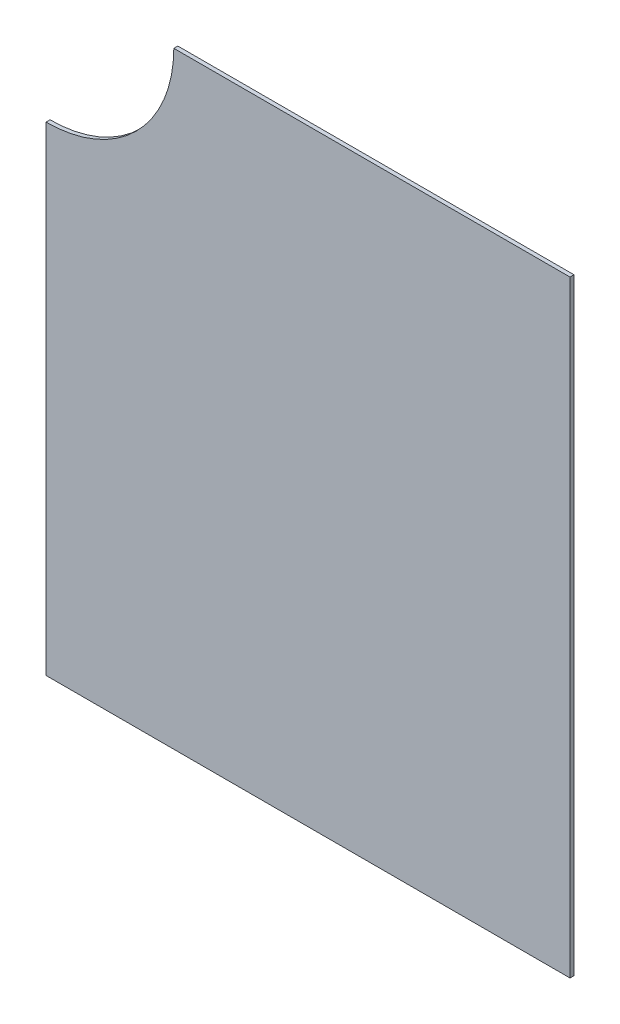
ISO-10303-21;
HEADER;
FILE_DESCRIPTION(('STEP AP214'),'2;1');
FILE_NAME('part.step','',(''),(''),'','','');
FILE_SCHEMA(('AUTOMOTIVE_DESIGN { 1 0 10303 214 1 1 1 1 }'));
ENDSEC;
DATA;
#1=APPLICATION_CONTEXT('core data for automotive mechanical design processes');
#2=APPLICATION_PROTOCOL_DEFINITION('international standard','automotive_design',2000,#1);
#3=PRODUCT_CONTEXT('',#1,'mechanical');
#4=PRODUCT('Part','Part','',(#3));
#5=PRODUCT_RELATED_PRODUCT_CATEGORY('part','',(#4));
#6=PRODUCT_DEFINITION_FORMATION('','',#4);
#7=PRODUCT_DEFINITION_CONTEXT('part definition',#1,'design');
#8=PRODUCT_DEFINITION('design','',#6,#7);
#9=PRODUCT_DEFINITION_SHAPE('','',#8);
#10=(LENGTH_UNIT() NAMED_UNIT(*) SI_UNIT(.MILLI.,.METRE.));
#11=(NAMED_UNIT(*) PLANE_ANGLE_UNIT() SI_UNIT($,.RADIAN.));
#12=(NAMED_UNIT(*) SI_UNIT($,.STERADIAN.) SOLID_ANGLE_UNIT());
#13=UNCERTAINTY_MEASURE_WITH_UNIT(LENGTH_MEASURE(1.E-05),#10,'distance_accuracy_value','');
#14=(GEOMETRIC_REPRESENTATION_CONTEXT(3) GLOBAL_UNCERTAINTY_ASSIGNED_CONTEXT((#13)) GLOBAL_UNIT_ASSIGNED_CONTEXT((#10,
#11,#12)) REPRESENTATION_CONTEXT('',''));
#15=CARTESIAN_POINT('',(0.,0.,0.));
#16=DIRECTION('',(0.,0.,1.));
#17=DIRECTION('',(1.,0.,0.));
#18=AXIS2_PLACEMENT_3D('',#15,#16,#17);
#19=CARTESIAN_POINT('',(0.,0.,0.79375));
#20=DIRECTION('',(0.,0.,-1.));
#21=DIRECTION('',(-1.,0.,0.));
#22=AXIS2_PLACEMENT_3D('',#19,#20,#21);
#23=CYLINDRICAL_SURFACE('',#22,50.8);
#24=CARTESIAN_POINT('',(0.,0.,-0.79375));
#25=DIRECTION('',(0.,0.,1.));
#26=DIRECTION('',(1.,0.,0.));
#27=AXIS2_PLACEMENT_3D('',#24,#25,#26);
#28=CIRCLE('',#27,50.8);
#29=CARTESIAN_POINT('',(0.,-50.8,-0.79375));
#30=VERTEX_POINT('',#29);
#31=CARTESIAN_POINT('',(50.8,0.,-0.79375));
#32=VERTEX_POINT('',#31);
#33=EDGE_CURVE('E122',#30,#32,#28,.T.);
#34=ORIENTED_EDGE('',*,*,#33,.F.);
#35=DIRECTION('',(0.,0.,-1.));
#36=VECTOR('',#35,1.);
#37=CARTESIAN_POINT('',(0.,-50.8,0.79375));
#38=LINE('',#37,#36);
#39=CARTESIAN_POINT('',(0.,-50.8,0.79375));
#40=VERTEX_POINT('',#39);
#41=EDGE_CURVE('E11',#40,#30,#38,.T.);
#42=ORIENTED_EDGE('',*,*,#41,.F.);
#43=CARTESIAN_POINT('',(0.,0.,0.79375));
#44=DIRECTION('',(0.,0.,1.));
#45=DIRECTION('',(1.,0.,0.));
#46=AXIS2_PLACEMENT_3D('',#43,#44,#45);
#47=CIRCLE('',#46,50.8);
#48=CARTESIAN_POINT('',(50.8,0.,0.79375));
#49=VERTEX_POINT('',#48);
#50=EDGE_CURVE('E137',#40,#49,#47,.T.);
#51=ORIENTED_EDGE('',*,*,#50,.T.);
#52=DIRECTION('',(0.,0.,-1.));
#53=VECTOR('',#52,1.);
#54=CARTESIAN_POINT('',(50.8,0.,0.79375));
#55=LINE('',#54,#53);
#56=EDGE_CURVE('E60',#49,#32,#55,.T.);
#57=ORIENTED_EDGE('',*,*,#56,.T.);
#58=EDGE_LOOP('',(#34,#42,#51,#57));
#59=FACE_BOUND('',#58,.T.);
#60=ADVANCED_FACE('F43',(#59),#23,.F.);
#61=CARTESIAN_POINT('',(0.,0.,0.79375));
#62=DIRECTION('',(1.,0.,0.));
#63=DIRECTION('',(0.,1.,0.));
#64=AXIS2_PLACEMENT_3D('',#61,#62,#63);
#65=PLANE('',#64);
#66=DIRECTION('',(0.,-1.,0.));
#67=VECTOR('',#66,1.);
#68=CARTESIAN_POINT('',(0.,0.,-0.79375));
#69=LINE('',#68,#67);
#70=CARTESIAN_POINT('',(0.,-241.3,-0.79375));
#71=VERTEX_POINT('',#70);
#72=EDGE_CURVE('E125',#30,#71,#69,.T.);
#73=ORIENTED_EDGE('',*,*,#72,.T.);
#74=DIRECTION('',(0.,0.,-1.));
#75=VECTOR('',#74,1.);
#76=CARTESIAN_POINT('',(0.,-241.3,0.79375));
#77=LINE('',#76,#75);
#78=CARTESIAN_POINT('',(0.,-241.3,0.79375));
#79=VERTEX_POINT('',#78);
#80=EDGE_CURVE('E52',#79,#71,#77,.T.);
#81=ORIENTED_EDGE('',*,*,#80,.F.);
#82=DIRECTION('',(0.,-1.,0.));
#83=VECTOR('',#82,1.);
#84=CARTESIAN_POINT('',(0.,0.,0.79375));
#85=LINE('',#84,#83);
#86=EDGE_CURVE('E99',#40,#79,#85,.T.);
#87=ORIENTED_EDGE('',*,*,#86,.F.);
#88=ORIENTED_EDGE('',*,*,#41,.T.);
#89=EDGE_LOOP('',(#73,#81,#87,#88));
#90=FACE_BOUND('',#89,.T.);
#91=ADVANCED_FACE('F157',(#90),#65,.F.);
#92=CARTESIAN_POINT('',(0.,-241.3,0.79375));
#93=DIRECTION('',(0.,1.,0.));
#94=DIRECTION('',(0.,0.,1.));
#95=AXIS2_PLACEMENT_3D('',#92,#93,#94);
#96=PLANE('',#95);
#97=DIRECTION('',(1.,0.,0.));
#98=VECTOR('',#97,1.);
#99=CARTESIAN_POINT('',(0.,-241.3,-0.79375));
#100=LINE('',#99,#98);
#101=CARTESIAN_POINT('',(208.28,-241.3,-0.79375));
#102=VERTEX_POINT('',#101);
#103=EDGE_CURVE('E109',#71,#102,#100,.T.);
#104=ORIENTED_EDGE('',*,*,#103,.T.);
#105=DIRECTION('',(0.,0.,-1.));
#106=VECTOR('',#105,1.);
#107=CARTESIAN_POINT('',(208.28,-241.3,0.79375));
#108=LINE('',#107,#106);
#109=CARTESIAN_POINT('',(208.28,-241.3,0.79375));
#110=VERTEX_POINT('',#109);
#111=EDGE_CURVE('E106',#110,#102,#108,.T.);
#112=ORIENTED_EDGE('',*,*,#111,.F.);
#113=DIRECTION('',(1.,0.,0.));
#114=VECTOR('',#113,1.);
#115=CARTESIAN_POINT('',(0.,-241.3,0.79375));
#116=LINE('',#115,#114);
#117=EDGE_CURVE('E92',#79,#110,#116,.T.);
#118=ORIENTED_EDGE('',*,*,#117,.F.);
#119=ORIENTED_EDGE('',*,*,#80,.T.);
#120=EDGE_LOOP('',(#104,#112,#118,#119));
#121=FACE_BOUND('',#120,.T.);
#122=ADVANCED_FACE('F107',(#121),#96,.F.);
#123=CARTESIAN_POINT('',(208.28,0.,0.79375));
#124=DIRECTION('',(1.,0.,0.));
#125=DIRECTION('',(0.,1.,0.));
#126=AXIS2_PLACEMENT_3D('',#123,#124,#125);
#127=PLANE('',#126);
#128=DIRECTION('',(0.,-1.,0.));
#129=VECTOR('',#128,1.);
#130=CARTESIAN_POINT('',(208.28,0.,-0.79375));
#131=LINE('',#130,#129);
#132=CARTESIAN_POINT('',(208.28,0.,-0.79375));
#133=VERTEX_POINT('',#132);
#134=EDGE_CURVE('E130',#133,#102,#131,.T.);
#135=ORIENTED_EDGE('',*,*,#134,.F.);
#136=DIRECTION('',(0.,0.,-1.));
#137=VECTOR('',#136,1.);
#138=CARTESIAN_POINT('',(208.28,0.,0.79375));
#139=LINE('',#138,#137);
#140=CARTESIAN_POINT('',(208.28,0.,0.79375));
#141=VERTEX_POINT('',#140);
#142=EDGE_CURVE('E76',#141,#133,#139,.T.);
#143=ORIENTED_EDGE('',*,*,#142,.F.);
#144=DIRECTION('',(0.,-1.,0.));
#145=VECTOR('',#144,1.);
#146=CARTESIAN_POINT('',(208.28,0.,0.79375));
#147=LINE('',#146,#145);
#148=EDGE_CURVE('E98',#141,#110,#147,.T.);
#149=ORIENTED_EDGE('',*,*,#148,.T.);
#150=ORIENTED_EDGE('',*,*,#111,.T.);
#151=EDGE_LOOP('',(#135,#143,#149,#150));
#152=FACE_BOUND('',#151,.T.);
#153=ADVANCED_FACE('F114',(#152),#127,.T.);
#154=CARTESIAN_POINT('',(0.,0.,0.79375));
#155=DIRECTION('',(0.,1.,0.));
#156=DIRECTION('',(0.,0.,1.));
#157=AXIS2_PLACEMENT_3D('',#154,#155,#156);
#158=PLANE('',#157);
#159=DIRECTION('',(1.,0.,0.));
#160=VECTOR('',#159,1.);
#161=CARTESIAN_POINT('',(0.,0.,-0.79375));
#162=LINE('',#161,#160);
#163=EDGE_CURVE('E133',#32,#133,#162,.T.);
#164=ORIENTED_EDGE('',*,*,#163,.F.);
#165=ORIENTED_EDGE('',*,*,#56,.F.);
#166=DIRECTION('',(1.,0.,0.));
#167=VECTOR('',#166,1.);
#168=CARTESIAN_POINT('',(0.,0.,0.79375));
#169=LINE('',#168,#167);
#170=EDGE_CURVE('E116',#49,#141,#169,.T.);
#171=ORIENTED_EDGE('',*,*,#170,.T.);
#172=ORIENTED_EDGE('',*,*,#142,.T.);
#173=EDGE_LOOP('',(#164,#165,#171,#172));
#174=FACE_BOUND('',#173,.T.);
#175=ADVANCED_FACE('F146',(#174),#158,.T.);
#176=CARTESIAN_POINT('',(0.,0.,0.79375));
#177=DIRECTION('',(0.,0.,1.));
#178=DIRECTION('',(1.,0.,0.));
#179=AXIS2_PLACEMENT_3D('',#176,#177,#178);
#180=PLANE('',#179);
#181=ORIENTED_EDGE('',*,*,#50,.F.);
#182=ORIENTED_EDGE('',*,*,#86,.T.);
#183=ORIENTED_EDGE('',*,*,#117,.T.);
#184=ORIENTED_EDGE('',*,*,#148,.F.);
#185=ORIENTED_EDGE('',*,*,#170,.F.);
#186=EDGE_LOOP('',(#181,#182,#183,#184,#185));
#187=FACE_BOUND('',#186,.T.);
#188=ADVANCED_FACE('F95',(#187),#180,.T.);
#189=CARTESIAN_POINT('',(0.,0.,-0.79375));
#190=DIRECTION('',(0.,0.,1.));
#191=DIRECTION('',(1.,0.,0.));
#192=AXIS2_PLACEMENT_3D('',#189,#190,#191);
#193=PLANE('',#192);
#194=ORIENTED_EDGE('',*,*,#33,.T.);
#195=ORIENTED_EDGE('',*,*,#163,.T.);
#196=ORIENTED_EDGE('',*,*,#134,.T.);
#197=ORIENTED_EDGE('',*,*,#103,.F.);
#198=ORIENTED_EDGE('',*,*,#72,.F.);
#199=EDGE_LOOP('',(#194,#195,#196,#197,#198));
#200=FACE_BOUND('',#199,.T.);
#201=ADVANCED_FACE('F145',(#200),#193,.F.);
#202=CLOSED_SHELL('',(#60,#91,#122,#153,#175,#188,#201));
#203=MANIFOLD_SOLID_BREP('B2',#202);
#204=ADVANCED_BREP_SHAPE_REPRESENTATION('',(#18,#203),#14);
#205=SHAPE_DEFINITION_REPRESENTATION(#9,#204);
ENDSEC;
END-ISO-10303-21;
